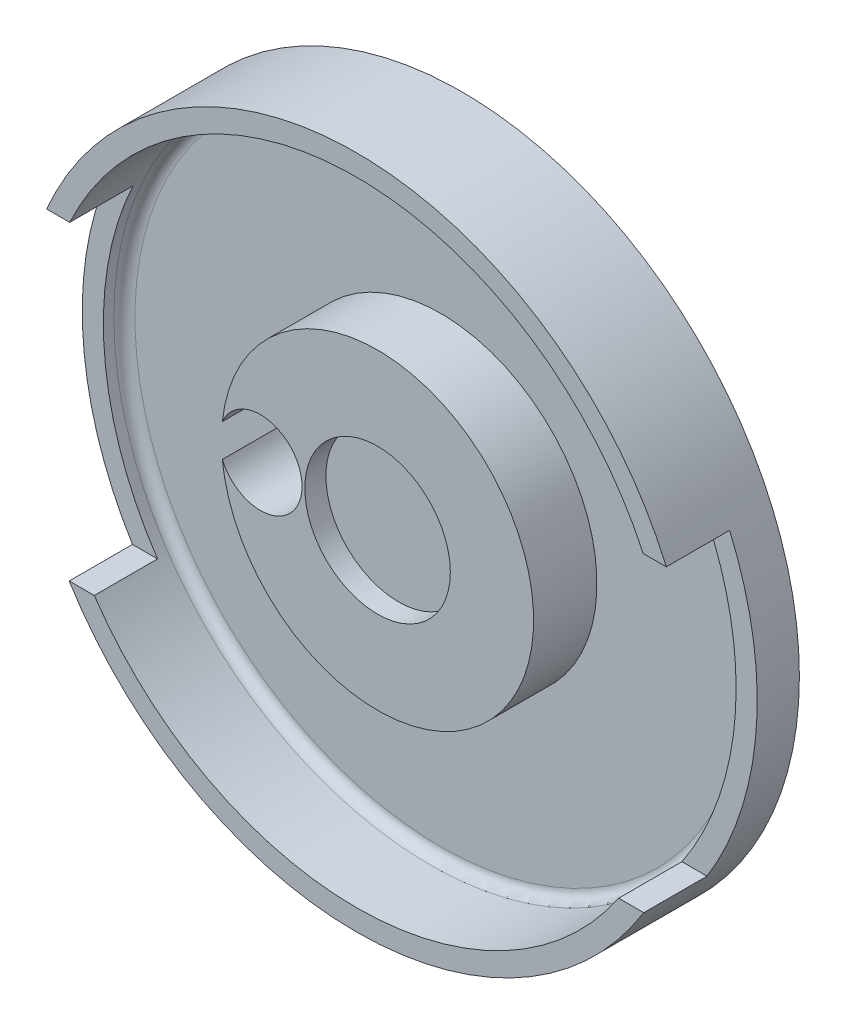
ISO-10303-21;
HEADER;
FILE_DESCRIPTION(('STEP AP214'),'2;1');
FILE_NAME('part.step','',(''),(''),'','','');
FILE_SCHEMA(('AUTOMOTIVE_DESIGN { 1 0 10303 214 1 1 1 1 }'));
ENDSEC;
DATA;
#1=APPLICATION_CONTEXT('core data for automotive mechanical design processes');
#2=APPLICATION_PROTOCOL_DEFINITION('international standard','automotive_design',2000,#1);
#3=PRODUCT_CONTEXT('',#1,'mechanical');
#4=PRODUCT('Part','Part','',(#3));
#5=PRODUCT_RELATED_PRODUCT_CATEGORY('part','',(#4));
#6=PRODUCT_DEFINITION_FORMATION('','',#4);
#7=PRODUCT_DEFINITION_CONTEXT('part definition',#1,'design');
#8=PRODUCT_DEFINITION('design','',#6,#7);
#9=PRODUCT_DEFINITION_SHAPE('','',#8);
#10=(LENGTH_UNIT() NAMED_UNIT(*) SI_UNIT(.MILLI.,.METRE.));
#11=(NAMED_UNIT(*) PLANE_ANGLE_UNIT() SI_UNIT($,.RADIAN.));
#12=(NAMED_UNIT(*) SI_UNIT($,.STERADIAN.) SOLID_ANGLE_UNIT());
#13=UNCERTAINTY_MEASURE_WITH_UNIT(LENGTH_MEASURE(1.E-05),#10,'distance_accuracy_value','');
#14=(GEOMETRIC_REPRESENTATION_CONTEXT(3) GLOBAL_UNCERTAINTY_ASSIGNED_CONTEXT((#13)) GLOBAL_UNIT_ASSIGNED_CONTEXT((#10,
#11,#12)) REPRESENTATION_CONTEXT('',''));
#15=CARTESIAN_POINT('',(0.,0.,0.));
#16=DIRECTION('',(0.,0.,1.));
#17=DIRECTION('',(1.,0.,0.));
#18=AXIS2_PLACEMENT_3D('',#15,#16,#17);
#19=CARTESIAN_POINT('',(0.,0.,5.));
#20=DIRECTION('',(0.,0.,1.));
#21=DIRECTION('',(1.,0.,0.));
#22=AXIS2_PLACEMENT_3D('',#19,#20,#21);
#23=PLANE('',#22);
#24=CARTESIAN_POINT('',(0.,0.,5.));
#25=DIRECTION('',(0.,0.,1.));
#26=DIRECTION('',(1.,0.,0.));
#27=AXIS2_PLACEMENT_3D('',#24,#25,#26);
#28=CIRCLE('',#27,16.);
#29=CARTESIAN_POINT('',(-13.6201960323075,-8.39584778575195,5.));
#30=VERTEX_POINT('',#29);
#31=CARTESIAN_POINT('',(13.6201960323075,-8.39584778575195,5.));
#32=VERTEX_POINT('',#31);
#33=EDGE_CURVE('E177',#30,#32,#28,.T.);
#34=ORIENTED_EDGE('',*,*,#33,.T.);
#35=DIRECTION('',(-1.,0.,0.));
#36=VECTOR('',#35,1.);
#37=CARTESIAN_POINT('',(0.,-8.39584778575195,5.));
#38=LINE('',#37,#36);
#39=CARTESIAN_POINT('',(12.4301946870708,-8.39584778575195,5.));
#40=VERTEX_POINT('',#39);
#41=EDGE_CURVE('E146',#32,#40,#38,.T.);
#42=ORIENTED_EDGE('',*,*,#41,.T.);
#43=CARTESIAN_POINT('',(0.,0.,5.));
#44=DIRECTION('',(0.,0.,1.));
#45=DIRECTION('',(1.,0.,0.));
#46=AXIS2_PLACEMENT_3D('',#43,#44,#45);
#47=CIRCLE('',#46,15.);
#48=CARTESIAN_POINT('',(-12.4301946870708,-8.39584778575195,5.));
#49=VERTEX_POINT('',#48);
#50=EDGE_CURVE('E174',#49,#40,#47,.T.);
#51=ORIENTED_EDGE('',*,*,#50,.F.);
#52=DIRECTION('',(1.,0.,0.));
#53=VECTOR('',#52,1.);
#54=CARTESIAN_POINT('',(0.,-8.39584778575195,5.));
#55=LINE('',#54,#53);
#56=EDGE_CURVE('E165',#30,#49,#55,.T.);
#57=ORIENTED_EDGE('',*,*,#56,.F.);
#58=EDGE_LOOP('',(#34,#42,#51,#57));
#59=FACE_BOUND('',#58,.T.);
#60=ADVANCED_FACE('F39',(#59),#23,.T.);
#61=CARTESIAN_POINT('',(0.,0.,5.));
#62=DIRECTION('',(0.,0.,-1.));
#63=DIRECTION('',(-1.,0.,0.));
#64=AXIS2_PLACEMENT_3D('',#61,#62,#63);
#65=CYLINDRICAL_SURFACE('',#64,16.);
#66=CARTESIAN_POINT('',(0.,0.,0.));
#67=DIRECTION('',(0.,0.,1.));
#68=DIRECTION('',(1.,0.,0.));
#69=AXIS2_PLACEMENT_3D('',#66,#67,#68);
#70=CIRCLE('',#69,16.);
#71=CARTESIAN_POINT('',(16.,0.,0.));
#72=VERTEX_POINT('',#71);
#73=EDGE_CURVE('E178',#72,#72,#70,.T.);
#74=ORIENTED_EDGE('',*,*,#73,.T.);
#75=EDGE_LOOP('',(#74));
#76=FACE_BOUND('',#75,.T.);
#77=CARTESIAN_POINT('',(14.6905696553376,6.33933460243845,5.));
#78=VERTEX_POINT('',#77);
#79=CARTESIAN_POINT('',(-14.6905696553376,6.33933460243845,5.));
#80=VERTEX_POINT('',#79);
#81=EDGE_CURVE('E182',#78,#80,#28,.T.);
#82=ORIENTED_EDGE('',*,*,#81,.F.);
#83=DIRECTION('',(0.,0.,-1.));
#84=VECTOR('',#83,1.);
#85=CARTESIAN_POINT('',(14.6905696553376,6.33933460243845,5.));
#86=LINE('',#85,#84);
#87=CARTESIAN_POINT('',(14.6905696553376,6.33933460243845,2.));
#88=VERTEX_POINT('',#87);
#89=EDGE_CURVE('E155',#78,#88,#86,.T.);
#90=ORIENTED_EDGE('',*,*,#89,.T.);
#91=CARTESIAN_POINT('',(0.,0.,2.));
#92=DIRECTION('',(0.,0.,-1.));
#93=DIRECTION('',(-1.,0.,0.));
#94=AXIS2_PLACEMENT_3D('',#91,#92,#93);
#95=CIRCLE('',#94,16.);
#96=CARTESIAN_POINT('',(13.6201960323075,-8.39584778575195,2.));
#97=VERTEX_POINT('',#96);
#98=EDGE_CURVE('E141',#88,#97,#95,.T.);
#99=ORIENTED_EDGE('',*,*,#98,.T.);
#100=DIRECTION('',(0.,0.,-1.));
#101=VECTOR('',#100,1.);
#102=CARTESIAN_POINT('',(13.6201960323075,-8.39584778575195,5.));
#103=LINE('',#102,#101);
#104=EDGE_CURVE('E148',#32,#97,#103,.T.);
#105=ORIENTED_EDGE('',*,*,#104,.F.);
#106=ORIENTED_EDGE('',*,*,#33,.F.);
#107=DIRECTION('',(0.,0.,-1.));
#108=VECTOR('',#107,1.);
#109=CARTESIAN_POINT('',(-13.6201960323075,-8.39584778575195,5.));
#110=LINE('',#109,#108);
#111=CARTESIAN_POINT('',(-13.6201960323075,-8.39584778575195,2.));
#112=VERTEX_POINT('',#111);
#113=EDGE_CURVE('E168',#30,#112,#110,.T.);
#114=ORIENTED_EDGE('',*,*,#113,.T.);
#115=CARTESIAN_POINT('',(0.,0.,2.));
#116=DIRECTION('',(0.,0.,-1.));
#117=DIRECTION('',(-1.,0.,0.));
#118=AXIS2_PLACEMENT_3D('',#115,#116,#117);
#119=CIRCLE('',#118,16.);
#120=CARTESIAN_POINT('',(-14.6905696553376,6.33933460243845,2.));
#121=VERTEX_POINT('',#120);
#122=EDGE_CURVE('E163',#112,#121,#119,.T.);
#123=ORIENTED_EDGE('',*,*,#122,.T.);
#124=DIRECTION('',(0.,0.,-1.));
#125=VECTOR('',#124,1.);
#126=CARTESIAN_POINT('',(-14.6905696553376,6.33933460243845,5.));
#127=LINE('',#126,#125);
#128=EDGE_CURVE('E175',#80,#121,#127,.T.);
#129=ORIENTED_EDGE('',*,*,#128,.F.);
#130=EDGE_LOOP('',(#82,#90,#99,#105,#106,#114,#123,#129));
#131=FACE_BOUND('',#130,.T.);
#132=ADVANCED_FACE('F222',(#76,#131),#65,.T.);
#133=DIRECTION('',(-1.,0.,0.));
#134=VECTOR('',#133,1.);
#135=CARTESIAN_POINT('',(0.,6.33933460243845,5.));
#136=LINE('',#135,#134);
#137=CARTESIAN_POINT('',(13.5945885115485,6.33933460243845,5.));
#138=VERTEX_POINT('',#137);
#139=EDGE_CURVE('E154',#78,#138,#136,.T.);
#140=ORIENTED_EDGE('',*,*,#139,.F.);
#141=ORIENTED_EDGE('',*,*,#81,.T.);
#142=DIRECTION('',(1.,0.,0.));
#143=VECTOR('',#142,1.);
#144=CARTESIAN_POINT('',(0.,6.33933460243845,5.));
#145=LINE('',#144,#143);
#146=CARTESIAN_POINT('',(-13.5945885115485,6.33933460243845,5.));
#147=VERTEX_POINT('',#146);
#148=EDGE_CURVE('E169',#80,#147,#145,.T.);
#149=ORIENTED_EDGE('',*,*,#148,.T.);
#150=EDGE_CURVE('E172',#138,#147,#47,.T.);
#151=ORIENTED_EDGE('',*,*,#150,.F.);
#152=EDGE_LOOP('',(#140,#141,#149,#151));
#153=FACE_BOUND('',#152,.T.);
#154=ADVANCED_FACE('F213',(#153),#23,.T.);
#155=CARTESIAN_POINT('',(0.,0.,1.));
#156=DIRECTION('',(0.,0.,1.));
#157=DIRECTION('',(1.,0.,0.));
#158=AXIS2_PLACEMENT_3D('',#155,#156,#157);
#159=CYLINDRICAL_SURFACE('',#158,15.);
#160=CARTESIAN_POINT('',(0.,0.,2.));
#161=DIRECTION('',(0.,0.,-1.));
#162=DIRECTION('',(-1.,0.,0.));
#163=AXIS2_PLACEMENT_3D('',#160,#161,#162);
#164=CIRCLE('',#163,15.);
#165=CARTESIAN_POINT('',(12.4301946870708,-8.39584778575195,2.));
#166=VERTEX_POINT('',#165);
#167=CARTESIAN_POINT('',(13.5945885115485,6.33933460243845,2.));
#168=VERTEX_POINT('',#167);
#169=EDGE_CURVE('E197',#166,#168,#164,.F.);
#170=ORIENTED_EDGE('',*,*,#169,.T.);
#171=DIRECTION('',(0.,0.,1.));
#172=VECTOR('',#171,1.);
#173=CARTESIAN_POINT('',(13.5945885115485,6.33933460243845,1.));
#174=LINE('',#173,#172);
#175=EDGE_CURVE('E43',#168,#138,#174,.T.);
#176=ORIENTED_EDGE('',*,*,#175,.T.);
#177=ORIENTED_EDGE('',*,*,#150,.T.);
#178=DIRECTION('',(0.,0.,1.));
#179=VECTOR('',#178,1.);
#180=CARTESIAN_POINT('',(-13.5945885115485,6.33933460243845,1.));
#181=LINE('',#180,#179);
#182=CARTESIAN_POINT('',(-13.5945885115485,6.33933460243845,2.));
#183=VERTEX_POINT('',#182);
#184=EDGE_CURVE('E196',#183,#147,#181,.T.);
#185=ORIENTED_EDGE('',*,*,#184,.F.);
#186=CARTESIAN_POINT('',(0.,0.,2.));
#187=DIRECTION('',(0.,0.,-1.));
#188=DIRECTION('',(-1.,0.,0.));
#189=AXIS2_PLACEMENT_3D('',#186,#187,#188);
#190=CIRCLE('',#189,15.);
#191=CARTESIAN_POINT('',(-12.4301946870708,-8.39584778575195,2.));
#192=VERTEX_POINT('',#191);
#193=EDGE_CURVE('E191',#183,#192,#190,.F.);
#194=ORIENTED_EDGE('',*,*,#193,.T.);
#195=DIRECTION('',(0.,0.,1.));
#196=VECTOR('',#195,1.);
#197=CARTESIAN_POINT('',(-12.4301946870708,-8.39584778575195,1.));
#198=LINE('',#197,#196);
#199=EDGE_CURVE('E193',#192,#49,#198,.T.);
#200=ORIENTED_EDGE('',*,*,#199,.T.);
#201=ORIENTED_EDGE('',*,*,#50,.T.);
#202=DIRECTION('',(0.,0.,1.));
#203=VECTOR('',#202,1.);
#204=CARTESIAN_POINT('',(12.4301946870708,-8.39584778575195,1.));
#205=LINE('',#204,#203);
#206=EDGE_CURVE('E202',#166,#40,#205,.T.);
#207=ORIENTED_EDGE('',*,*,#206,.F.);
#208=EDGE_LOOP('',(#170,#176,#177,#185,#194,#200,#201,#207));
#209=FACE_BOUND('',#208,.T.);
#210=CARTESIAN_POINT('',(0.,0.,1.5));
#211=DIRECTION('',(0.,0.,1.));
#212=DIRECTION('',(1.,0.,0.));
#213=AXIS2_PLACEMENT_3D('',#210,#211,#212);
#214=CIRCLE('',#213,15.);
#215=CARTESIAN_POINT('',(15.,0.,1.5));
#216=VERTEX_POINT('',#215);
#217=EDGE_CURVE('E189',#216,#216,#214,.F.);
#218=ORIENTED_EDGE('',*,*,#217,.T.);
#219=EDGE_LOOP('',(#218));
#220=FACE_BOUND('',#219,.T.);
#221=ADVANCED_FACE('F206',(#209,#220),#159,.F.);
#222=CARTESIAN_POINT('',(0.,0.,0.));
#223=DIRECTION('',(0.,0.,1.));
#224=DIRECTION('',(1.,0.,0.));
#225=AXIS2_PLACEMENT_3D('',#222,#223,#224);
#226=PLANE('',#225);
#227=CARTESIAN_POINT('',(-5.54966081388172,0.,0.));
#228=DIRECTION('',(0.,0.,1.));
#229=DIRECTION('',(1.,0.,0.));
#230=AXIS2_PLACEMENT_3D('',#227,#228,#229);
#231=CIRCLE('',#230,1.96944750254763);
#232=CARTESIAN_POINT('',(-3.5802133113341,0.,0.));
#233=VERTEX_POINT('',#232);
#234=EDGE_CURVE('E127',#233,#233,#231,.T.);
#235=ORIENTED_EDGE('',*,*,#234,.T.);
#236=EDGE_LOOP('',(#235));
#237=FACE_BOUND('',#236,.T.);
#238=ORIENTED_EDGE('',*,*,#73,.F.);
#239=EDGE_LOOP('',(#238));
#240=FACE_BOUND('',#239,.T.);
#241=ADVANCED_FACE('F257',(#237,#240),#226,.F.);
#242=CARTESIAN_POINT('',(0.,0.,1.));
#243=DIRECTION('',(0.,0.,1.));
#244=DIRECTION('',(1.,0.,0.));
#245=AXIS2_PLACEMENT_3D('',#242,#243,#244);
#246=PLANE('',#245);
#247=CARTESIAN_POINT('',(-5.54966081388172,0.,1.));
#248=DIRECTION('',(0.,0.,1.));
#249=DIRECTION('',(1.,0.,0.));
#250=AXIS2_PLACEMENT_3D('',#247,#248,#249);
#251=CIRCLE('',#250,1.96944750254763);
#252=CARTESIAN_POINT('',(-7.35900935418718,0.777805454458639,1.));
#253=VERTEX_POINT('',#252);
#254=CARTESIAN_POINT('',(-7.35900935418718,-0.777805454458644,1.));
#255=VERTEX_POINT('',#254);
#256=EDGE_CURVE('E54',#253,#255,#251,.T.);
#257=ORIENTED_EDGE('',*,*,#256,.F.);
#258=CARTESIAN_POINT('',(0.,0.,1.));
#259=DIRECTION('',(0.,0.,1.));
#260=DIRECTION('',(1.,0.,0.));
#261=AXIS2_PLACEMENT_3D('',#258,#259,#260);
#262=CIRCLE('',#261,7.4);
#263=EDGE_CURVE('E130',#255,#253,#262,.T.);
#264=ORIENTED_EDGE('',*,*,#263,.F.);
#265=EDGE_LOOP('',(#257,#264));
#266=FACE_BOUND('',#265,.T.);
#267=CARTESIAN_POINT('',(0.,0.,1.));
#268=DIRECTION('',(0.,0.,1.));
#269=DIRECTION('',(1.,0.,0.));
#270=AXIS2_PLACEMENT_3D('',#267,#268,#269);
#271=CIRCLE('',#270,14.5);
#272=CARTESIAN_POINT('',(14.5,0.,1.));
#273=VERTEX_POINT('',#272);
#274=EDGE_CURVE('E185',#273,#273,#271,.T.);
#275=ORIENTED_EDGE('',*,*,#274,.T.);
#276=EDGE_LOOP('',(#275));
#277=FACE_BOUND('',#276,.T.);
#278=ADVANCED_FACE('F261',(#266,#277),#246,.T.);
#279=CARTESIAN_POINT('',(0.,0.,1.5));
#280=DIRECTION('',(0.,0.,1.));
#281=DIRECTION('',(1.,0.,0.));
#282=AXIS2_PLACEMENT_3D('',#279,#280,#281);
#283=TOROIDAL_SURFACE('',#282,14.5,0.5);
#284=ORIENTED_EDGE('',*,*,#217,.F.);
#285=EDGE_LOOP('',(#284));
#286=FACE_BOUND('',#285,.T.);
#287=ORIENTED_EDGE('',*,*,#274,.F.);
#288=EDGE_LOOP('',(#287));
#289=FACE_BOUND('',#288,.T.);
#290=ADVANCED_FACE('F41',(#286,#289),#283,.F.);
#291=CARTESIAN_POINT('',(-17.0905034214387,6.33933460243845,2.));
#292=DIRECTION('',(0.,-1.,0.));
#293=DIRECTION('',(0.,0.,-1.));
#294=AXIS2_PLACEMENT_3D('',#291,#292,#293);
#295=PLANE('',#294);
#296=ORIENTED_EDGE('',*,*,#128,.T.);
#297=DIRECTION('',(1.,0.,0.));
#298=VECTOR('',#297,1.);
#299=CARTESIAN_POINT('',(-17.0905034214387,6.33933460243845,2.));
#300=LINE('',#299,#298);
#301=EDGE_CURVE('E156',#121,#183,#300,.T.);
#302=ORIENTED_EDGE('',*,*,#301,.T.);
#303=ORIENTED_EDGE('',*,*,#184,.T.);
#304=ORIENTED_EDGE('',*,*,#148,.F.);
#305=EDGE_LOOP('',(#296,#302,#303,#304));
#306=FACE_BOUND('',#305,.T.);
#307=ADVANCED_FACE('F218',(#306),#295,.T.);
#308=CARTESIAN_POINT('',(-17.0905034214387,-8.39584778575195,2.));
#309=DIRECTION('',(0.,-1.,0.));
#310=DIRECTION('',(0.,0.,-1.));
#311=AXIS2_PLACEMENT_3D('',#308,#309,#310);
#312=PLANE('',#311);
#313=ORIENTED_EDGE('',*,*,#56,.T.);
#314=ORIENTED_EDGE('',*,*,#199,.F.);
#315=DIRECTION('',(1.,0.,0.));
#316=VECTOR('',#315,1.);
#317=CARTESIAN_POINT('',(-17.0905034214387,-8.39584778575195,2.));
#318=LINE('',#317,#316);
#319=EDGE_CURVE('E158',#112,#192,#318,.T.);
#320=ORIENTED_EDGE('',*,*,#319,.F.);
#321=ORIENTED_EDGE('',*,*,#113,.F.);
#322=EDGE_LOOP('',(#313,#314,#320,#321));
#323=FACE_BOUND('',#322,.T.);
#324=ADVANCED_FACE('F230',(#323),#312,.F.);
#325=CARTESIAN_POINT('',(0.,0.,2.));
#326=DIRECTION('',(0.,0.,-1.));
#327=DIRECTION('',(-1.,0.,0.));
#328=AXIS2_PLACEMENT_3D('',#325,#326,#327);
#329=PLANE('',#328);
#330=ORIENTED_EDGE('',*,*,#319,.T.);
#331=ORIENTED_EDGE('',*,*,#193,.F.);
#332=ORIENTED_EDGE('',*,*,#301,.F.);
#333=ORIENTED_EDGE('',*,*,#122,.F.);
#334=EDGE_LOOP('',(#330,#331,#332,#333));
#335=FACE_BOUND('',#334,.T.);
#336=ADVANCED_FACE('F228',(#335),#329,.F.);
#337=CARTESIAN_POINT('',(17.0905034214387,6.33933460243845,2.));
#338=DIRECTION('',(0.,1.,0.));
#339=DIRECTION('',(0.,0.,1.));
#340=AXIS2_PLACEMENT_3D('',#337,#338,#339);
#341=PLANE('',#340);
#342=ORIENTED_EDGE('',*,*,#139,.T.);
#343=ORIENTED_EDGE('',*,*,#175,.F.);
#344=DIRECTION('',(-1.,0.,0.));
#345=VECTOR('',#344,1.);
#346=CARTESIAN_POINT('',(17.0905034214387,6.33933460243845,2.));
#347=LINE('',#346,#345);
#348=EDGE_CURVE('E62',#88,#168,#347,.T.);
#349=ORIENTED_EDGE('',*,*,#348,.F.);
#350=ORIENTED_EDGE('',*,*,#89,.F.);
#351=EDGE_LOOP('',(#342,#343,#349,#350));
#352=FACE_BOUND('',#351,.T.);
#353=ADVANCED_FACE('F240',(#352),#341,.F.);
#354=CARTESIAN_POINT('',(17.0905034214387,-8.39584778575195,2.));
#355=DIRECTION('',(0.,1.,0.));
#356=DIRECTION('',(0.,0.,1.));
#357=AXIS2_PLACEMENT_3D('',#354,#355,#356);
#358=PLANE('',#357);
#359=ORIENTED_EDGE('',*,*,#104,.T.);
#360=DIRECTION('',(-1.,0.,0.));
#361=VECTOR('',#360,1.);
#362=CARTESIAN_POINT('',(17.0905034214387,-8.39584778575195,2.));
#363=LINE('',#362,#361);
#364=EDGE_CURVE('E135',#97,#166,#363,.T.);
#365=ORIENTED_EDGE('',*,*,#364,.T.);
#366=ORIENTED_EDGE('',*,*,#206,.T.);
#367=ORIENTED_EDGE('',*,*,#41,.F.);
#368=EDGE_LOOP('',(#359,#365,#366,#367));
#369=FACE_BOUND('',#368,.T.);
#370=ADVANCED_FACE('F234',(#369),#358,.T.);
#371=CARTESIAN_POINT('',(0.,0.,2.));
#372=DIRECTION('',(0.,0.,-1.));
#373=DIRECTION('',(1.,0.,0.));
#374=AXIS2_PLACEMENT_3D('',#371,#372,#373);
#375=PLANE('',#374);
#376=ORIENTED_EDGE('',*,*,#348,.T.);
#377=ORIENTED_EDGE('',*,*,#169,.F.);
#378=ORIENTED_EDGE('',*,*,#364,.F.);
#379=ORIENTED_EDGE('',*,*,#98,.F.);
#380=EDGE_LOOP('',(#376,#377,#378,#379));
#381=FACE_BOUND('',#380,.T.);
#382=ADVANCED_FACE('F236',(#381),#375,.F.);
#383=CARTESIAN_POINT('',(0.,0.,4.));
#384=DIRECTION('',(0.,0.,-1.));
#385=DIRECTION('',(-1.,0.,0.));
#386=AXIS2_PLACEMENT_3D('',#383,#384,#385);
#387=CYLINDRICAL_SURFACE('',#386,7.4);
#388=ORIENTED_EDGE('',*,*,#263,.T.);
#389=DIRECTION('',(0.,0.,1.));
#390=VECTOR('',#389,1.);
#391=CARTESIAN_POINT('',(-7.35900935418718,0.777805454458639,-1.));
#392=LINE('',#391,#390);
#393=CARTESIAN_POINT('',(-7.35900935418718,0.777805454458639,4.));
#394=VERTEX_POINT('',#393);
#395=EDGE_CURVE('E120',#253,#394,#392,.T.);
#396=ORIENTED_EDGE('',*,*,#395,.T.);
#397=CARTESIAN_POINT('',(0.,0.,4.));
#398=DIRECTION('',(0.,0.,1.));
#399=DIRECTION('',(1.,0.,0.));
#400=AXIS2_PLACEMENT_3D('',#397,#398,#399);
#401=CIRCLE('',#400,7.4);
#402=CARTESIAN_POINT('',(-7.35900935418718,-0.777805454458639,4.));
#403=VERTEX_POINT('',#402);
#404=EDGE_CURVE('E123',#403,#394,#401,.T.);
#405=ORIENTED_EDGE('',*,*,#404,.F.);
#406=DIRECTION('',(0.,0.,1.));
#407=VECTOR('',#406,1.);
#408=CARTESIAN_POINT('',(-7.35900935418718,-0.777805454458639,-1.));
#409=LINE('',#408,#407);
#410=EDGE_CURVE('E117',#403,#255,#409,.F.);
#411=ORIENTED_EDGE('',*,*,#410,.T.);
#412=EDGE_LOOP('',(#388,#396,#405,#411));
#413=FACE_BOUND('',#412,.T.);
#414=ADVANCED_FACE('F121',(#413),#387,.T.);
#415=CARTESIAN_POINT('',(0.,0.,4.));
#416=DIRECTION('',(0.,0.,1.));
#417=DIRECTION('',(1.,0.,0.));
#418=AXIS2_PLACEMENT_3D('',#415,#416,#417);
#419=PLANE('',#418);
#420=CARTESIAN_POINT('',(-5.54966081388172,0.,4.));
#421=DIRECTION('',(0.,0.,1.));
#422=DIRECTION('',(1.,0.,0.));
#423=AXIS2_PLACEMENT_3D('',#420,#421,#422);
#424=CIRCLE('',#423,1.96944750254763);
#425=EDGE_CURVE('E11',#403,#394,#424,.T.);
#426=ORIENTED_EDGE('',*,*,#425,.F.);
#427=ORIENTED_EDGE('',*,*,#404,.T.);
#428=EDGE_LOOP('',(#426,#427));
#429=FACE_BOUND('',#428,.T.);
#430=CARTESIAN_POINT('',(0.,0.,4.));
#431=DIRECTION('',(0.,0.,1.));
#432=DIRECTION('',(1.,0.,0.));
#433=AXIS2_PLACEMENT_3D('',#430,#431,#432);
#434=CIRCLE('',#433,3.45);
#435=CARTESIAN_POINT('',(3.45,0.,4.));
#436=VERTEX_POINT('',#435);
#437=EDGE_CURVE('E139',#436,#436,#434,.T.);
#438=ORIENTED_EDGE('',*,*,#437,.F.);
#439=EDGE_LOOP('',(#438));
#440=FACE_BOUND('',#439,.T.);
#441=ADVANCED_FACE('F129',(#429,#440),#419,.T.);
#442=CARTESIAN_POINT('',(0.,0.,3.));
#443=DIRECTION('',(0.,0.,1.));
#444=DIRECTION('',(1.,0.,0.));
#445=AXIS2_PLACEMENT_3D('',#442,#443,#444);
#446=CYLINDRICAL_SURFACE('',#445,3.45);
#447=CARTESIAN_POINT('',(0.,0.,3.));
#448=DIRECTION('',(0.,0.,1.));
#449=DIRECTION('',(1.,0.,0.));
#450=AXIS2_PLACEMENT_3D('',#447,#448,#449);
#451=CIRCLE('',#450,3.45);
#452=CARTESIAN_POINT('',(3.45,0.,3.));
#453=VERTEX_POINT('',#452);
#454=EDGE_CURVE('E132',#453,#453,#451,.T.);
#455=ORIENTED_EDGE('',*,*,#454,.F.);
#456=EDGE_LOOP('',(#455));
#457=FACE_BOUND('',#456,.T.);
#458=ORIENTED_EDGE('',*,*,#437,.T.);
#459=EDGE_LOOP('',(#458));
#460=FACE_BOUND('',#459,.T.);
#461=ADVANCED_FACE('F325',(#457,#460),#446,.F.);
#462=CARTESIAN_POINT('',(0.,0.,3.));
#463=DIRECTION('',(0.,0.,1.));
#464=DIRECTION('',(1.,0.,0.));
#465=AXIS2_PLACEMENT_3D('',#462,#463,#464);
#466=PLANE('',#465);
#467=ORIENTED_EDGE('',*,*,#454,.T.);
#468=EDGE_LOOP('',(#467));
#469=FACE_BOUND('',#468,.T.);
#470=ADVANCED_FACE('F331',(#469),#466,.T.);
#471=CARTESIAN_POINT('',(-5.54966081388172,0.,-6.));
#472=DIRECTION('',(0.,0.,1.));
#473=DIRECTION('',(1.,0.,0.));
#474=AXIS2_PLACEMENT_3D('',#471,#472,#473);
#475=CYLINDRICAL_SURFACE('',#474,1.96944750254763);
#476=ORIENTED_EDGE('',*,*,#256,.T.);
#477=ORIENTED_EDGE('',*,*,#410,.F.);
#478=ORIENTED_EDGE('',*,*,#425,.T.);
#479=ORIENTED_EDGE('',*,*,#395,.F.);
#480=EDGE_LOOP('',(#476,#477,#478,#479));
#481=FACE_BOUND('',#480,.T.);
#482=ORIENTED_EDGE('',*,*,#234,.F.);
#483=EDGE_LOOP('',(#482));
#484=FACE_BOUND('',#483,.T.);
#485=ADVANCED_FACE('F114',(#481,#484),#475,.F.);
#486=CLOSED_SHELL('',(#60,#132,#154,#221,#241,#278,#290,#307,#324,#336,#353,#370,#382,#414,#441,
#461,#470,#485));
#487=MANIFOLD_SOLID_BREP('B2',#486);
#488=ADVANCED_BREP_SHAPE_REPRESENTATION('',(#18,#487),#14);
#489=SHAPE_DEFINITION_REPRESENTATION(#9,#488);
ENDSEC;
END-ISO-10303-21;
